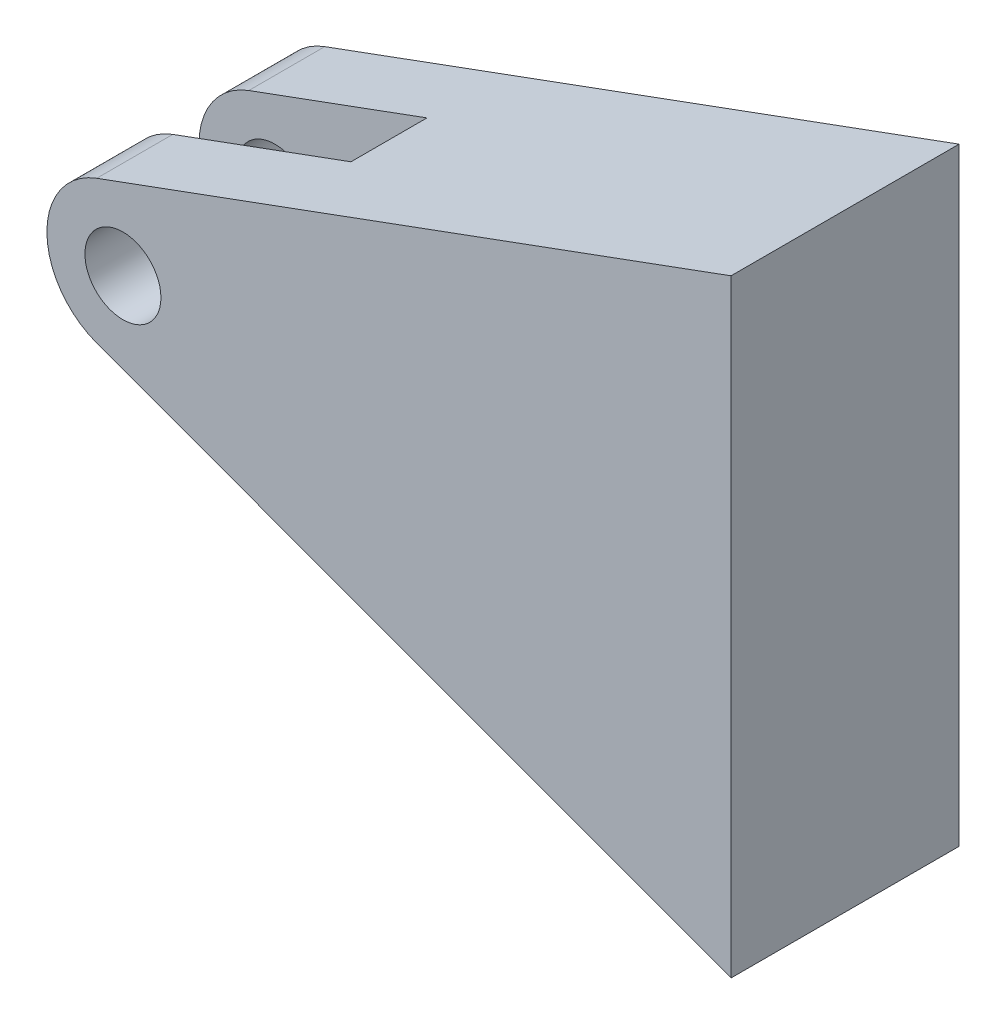
ISO-10303-21;
HEADER;
FILE_DESCRIPTION(('STEP AP214'),'2;1');
FILE_NAME('part.step','',(''),(''),'','','');
FILE_SCHEMA(('AUTOMOTIVE_DESIGN { 1 0 10303 214 1 1 1 1 }'));
ENDSEC;
DATA;
#1=APPLICATION_CONTEXT('core data for automotive mechanical design processes');
#2=APPLICATION_PROTOCOL_DEFINITION('international standard','automotive_design',2000,#1);
#3=PRODUCT_CONTEXT('',#1,'mechanical');
#4=PRODUCT('Part','Part','',(#3));
#5=PRODUCT_RELATED_PRODUCT_CATEGORY('part','',(#4));
#6=PRODUCT_DEFINITION_FORMATION('','',#4);
#7=PRODUCT_DEFINITION_CONTEXT('part definition',#1,'design');
#8=PRODUCT_DEFINITION('design','',#6,#7);
#9=PRODUCT_DEFINITION_SHAPE('','',#8);
#10=(LENGTH_UNIT() NAMED_UNIT(*) SI_UNIT(.MILLI.,.METRE.));
#11=(NAMED_UNIT(*) PLANE_ANGLE_UNIT() SI_UNIT($,.RADIAN.));
#12=(NAMED_UNIT(*) SI_UNIT($,.STERADIAN.) SOLID_ANGLE_UNIT());
#13=UNCERTAINTY_MEASURE_WITH_UNIT(LENGTH_MEASURE(1.E-05),#10,'distance_accuracy_value','');
#14=(GEOMETRIC_REPRESENTATION_CONTEXT(3) GLOBAL_UNCERTAINTY_ASSIGNED_CONTEXT((#13)) GLOBAL_UNIT_ASSIGNED_CONTEXT((#10,
#11,#12)) REPRESENTATION_CONTEXT('',''));
#15=CARTESIAN_POINT('',(0.,0.,0.));
#16=DIRECTION('',(0.,0.,1.));
#17=DIRECTION('',(1.,0.,0.));
#18=AXIS2_PLACEMENT_3D('',#15,#16,#17);
#19=CARTESIAN_POINT('',(0.,0.,15.));
#20=DIRECTION('',(0.,0.,-1.));
#21=DIRECTION('',(-1.,0.,0.));
#22=AXIS2_PLACEMENT_3D('',#19,#20,#21);
#23=CYLINDRICAL_SURFACE('',#22,5.);
#24=CARTESIAN_POINT('',(0.,0.,10.));
#25=DIRECTION('',(0.,0.,1.));
#26=DIRECTION('',(1.,0.,0.));
#27=AXIS2_PLACEMENT_3D('',#24,#25,#26);
#28=CIRCLE('',#27,5.);
#29=CARTESIAN_POINT('',(-1.7220486043289,4.69409720865779,10.));
#30=VERTEX_POINT('',#29);
#31=CARTESIAN_POINT('',(-1.7220486043289,-4.69409720865779,10.));
#32=VERTEX_POINT('',#31);
#33=EDGE_CURVE('E115',#30,#32,#28,.T.);
#34=ORIENTED_EDGE('',*,*,#33,.T.);
#35=DIRECTION('',(0.,0.,-1.));
#36=VECTOR('',#35,1.);
#37=CARTESIAN_POINT('',(-1.7220486043289,-4.69409720865779,15.));
#38=LINE('',#37,#36);
#39=CARTESIAN_POINT('',(-1.7220486043289,-4.69409720865779,15.));
#40=VERTEX_POINT('',#39);
#41=EDGE_CURVE('E157',#40,#32,#38,.T.);
#42=ORIENTED_EDGE('',*,*,#41,.F.);
#43=CARTESIAN_POINT('',(0.,0.,15.));
#44=DIRECTION('',(0.,0.,1.));
#45=DIRECTION('',(1.,0.,0.));
#46=AXIS2_PLACEMENT_3D('',#43,#44,#45);
#47=CIRCLE('',#46,5.);
#48=CARTESIAN_POINT('',(-1.7220486043289,4.69409720865779,15.));
#49=VERTEX_POINT('',#48);
#50=EDGE_CURVE('E143',#49,#40,#47,.T.);
#51=ORIENTED_EDGE('',*,*,#50,.F.);
#52=DIRECTION('',(0.,0.,-1.));
#53=VECTOR('',#52,1.);
#54=CARTESIAN_POINT('',(-1.7220486043289,4.69409720865779,15.));
#55=LINE('',#54,#53);
#56=EDGE_CURVE('E161',#49,#30,#55,.T.);
#57=ORIENTED_EDGE('',*,*,#56,.T.);
#58=EDGE_LOOP('',(#34,#42,#51,#57));
#59=FACE_BOUND('',#58,.T.);
#60=ADVANCED_FACE('F35',(#59),#23,.T.);
#61=CARTESIAN_POINT('',(0.,0.,15.));
#62=DIRECTION('',(0.,0.,-1.));
#63=DIRECTION('',(-1.,0.,0.));
#64=AXIS2_PLACEMENT_3D('',#61,#62,#63);
#65=CYLINDRICAL_SURFACE('',#64,2.5);
#66=CARTESIAN_POINT('',(0.,0.,5.));
#67=DIRECTION('',(0.,0.,-1.));
#68=DIRECTION('',(-1.,0.,0.));
#69=AXIS2_PLACEMENT_3D('',#66,#67,#68);
#70=CIRCLE('',#69,2.5);
#71=CARTESIAN_POINT('',(-2.5,0.,5.));
#72=VERTEX_POINT('',#71);
#73=EDGE_CURVE('E118',#72,#72,#70,.T.);
#74=ORIENTED_EDGE('',*,*,#73,.F.);
#75=EDGE_LOOP('',(#74));
#76=FACE_BOUND('',#75,.T.);
#77=CARTESIAN_POINT('',(0.,0.,0.));
#78=DIRECTION('',(0.,0.,1.));
#79=DIRECTION('',(1.,0.,0.));
#80=AXIS2_PLACEMENT_3D('',#77,#78,#79);
#81=CIRCLE('',#80,2.5);
#82=CARTESIAN_POINT('',(2.5,0.,0.));
#83=VERTEX_POINT('',#82);
#84=EDGE_CURVE('E128',#83,#83,#81,.T.);
#85=ORIENTED_EDGE('',*,*,#84,.F.);
#86=EDGE_LOOP('',(#85));
#87=FACE_BOUND('',#86,.T.);
#88=ADVANCED_FACE('F203',(#76,#87),#65,.F.);
#89=CARTESIAN_POINT('',(0.,0.,15.));
#90=DIRECTION('',(0.,0.,1.));
#91=DIRECTION('',(1.,0.,0.));
#92=AXIS2_PLACEMENT_3D('',#89,#90,#91);
#93=PLANE('',#92);
#94=DIRECTION('',(0.,1.,0.));
#95=VECTOR('',#94,1.);
#96=CARTESIAN_POINT('',(40.,20.,15.));
#97=LINE('',#96,#95);
#98=CARTESIAN_POINT('',(40.,-20.,15.));
#99=VERTEX_POINT('',#98);
#100=CARTESIAN_POINT('',(40.,20.,15.));
#101=VERTEX_POINT('',#100);
#102=EDGE_CURVE('E58',#99,#101,#97,.T.);
#103=ORIENTED_EDGE('',*,*,#102,.T.);
#104=DIRECTION('',(-0.938819441731559,-0.34440972086578,0.));
#105=VECTOR('',#104,1.);
#106=CARTESIAN_POINT('',(40.,20.,15.));
#107=LINE('',#106,#105);
#108=EDGE_CURVE('E87',#101,#49,#107,.T.);
#109=ORIENTED_EDGE('',*,*,#108,.T.);
#110=ORIENTED_EDGE('',*,*,#50,.T.);
#111=DIRECTION('',(0.938819441731559,-0.34440972086578,0.));
#112=VECTOR('',#111,1.);
#113=CARTESIAN_POINT('',(40.,-20.,15.));
#114=LINE('',#113,#112);
#115=EDGE_CURVE('E145',#40,#99,#114,.T.);
#116=ORIENTED_EDGE('',*,*,#115,.T.);
#117=EDGE_LOOP('',(#103,#109,#110,#116));
#118=FACE_BOUND('',#117,.T.);
#119=CARTESIAN_POINT('',(0.,0.,15.));
#120=DIRECTION('',(0.,0.,1.));
#121=DIRECTION('',(1.,0.,0.));
#122=AXIS2_PLACEMENT_3D('',#119,#120,#121);
#123=CIRCLE('',#122,2.5);
#124=CARTESIAN_POINT('',(2.5,0.,15.));
#125=VERTEX_POINT('',#124);
#126=EDGE_CURVE('E131',#125,#125,#123,.T.);
#127=ORIENTED_EDGE('',*,*,#126,.F.);
#128=EDGE_LOOP('',(#127));
#129=FACE_BOUND('',#128,.T.);
#130=ADVANCED_FACE('F185',(#118,#129),#93,.T.);
#131=CARTESIAN_POINT('',(0.,0.,0.));
#132=DIRECTION('',(0.,0.,1.));
#133=DIRECTION('',(1.,0.,0.));
#134=AXIS2_PLACEMENT_3D('',#131,#132,#133);
#135=PLANE('',#134);
#136=DIRECTION('',(-0.938819441731559,-0.34440972086578,0.));
#137=VECTOR('',#136,1.);
#138=CARTESIAN_POINT('',(40.,20.,0.));
#139=LINE('',#138,#137);
#140=CARTESIAN_POINT('',(40.,20.,0.));
#141=VERTEX_POINT('',#140);
#142=CARTESIAN_POINT('',(-1.7220486043289,4.69409720865779,0.));
#143=VERTEX_POINT('',#142);
#144=EDGE_CURVE('E138',#141,#143,#139,.T.);
#145=ORIENTED_EDGE('',*,*,#144,.F.);
#146=DIRECTION('',(0.,1.,0.));
#147=VECTOR('',#146,1.);
#148=CARTESIAN_POINT('',(40.,0.,0.));
#149=LINE('',#148,#147);
#150=CARTESIAN_POINT('',(40.,-20.,0.));
#151=VERTEX_POINT('',#150);
#152=EDGE_CURVE('E141',#151,#141,#149,.T.);
#153=ORIENTED_EDGE('',*,*,#152,.F.);
#154=DIRECTION('',(0.938819441731559,-0.34440972086578,0.));
#155=VECTOR('',#154,1.);
#156=CARTESIAN_POINT('',(40.,-20.,0.));
#157=LINE('',#156,#155);
#158=CARTESIAN_POINT('',(-1.7220486043289,-4.69409720865779,0.));
#159=VERTEX_POINT('',#158);
#160=EDGE_CURVE('E80',#159,#151,#157,.T.);
#161=ORIENTED_EDGE('',*,*,#160,.F.);
#162=CARTESIAN_POINT('',(0.,0.,0.));
#163=DIRECTION('',(0.,0.,1.));
#164=DIRECTION('',(1.,0.,0.));
#165=AXIS2_PLACEMENT_3D('',#162,#163,#164);
#166=CIRCLE('',#165,5.);
#167=EDGE_CURVE('E150',#143,#159,#166,.T.);
#168=ORIENTED_EDGE('',*,*,#167,.F.);
#169=EDGE_LOOP('',(#145,#153,#161,#168));
#170=FACE_BOUND('',#169,.T.);
#171=ORIENTED_EDGE('',*,*,#84,.T.);
#172=EDGE_LOOP('',(#171));
#173=FACE_BOUND('',#172,.T.);
#174=ADVANCED_FACE('F192',(#170,#173),#135,.F.);
#175=CARTESIAN_POINT('',(40.,20.,15.));
#176=DIRECTION('',(0.34440972086578,-0.938819441731559,0.));
#177=DIRECTION('',(0.938819441731559,0.34440972086578,0.));
#178=AXIS2_PLACEMENT_3D('',#175,#176,#177);
#179=PLANE('',#178);
#180=CARTESIAN_POINT('',(-1.7220486043289,4.69409720865779,5.));
#181=VERTEX_POINT('',#180);
#182=EDGE_CURVE('E160',#181,#143,#55,.T.);
#183=ORIENTED_EDGE('',*,*,#182,.F.);
#184=DIRECTION('',(0.938819441731559,0.34440972086578,0.));
#185=VECTOR('',#184,1.);
#186=CARTESIAN_POINT('',(40.,20.,5.));
#187=LINE('',#186,#185);
#188=CARTESIAN_POINT('',(10.,8.99437829395981,5.));
#189=VERTEX_POINT('',#188);
#190=EDGE_CURVE('E127',#181,#189,#187,.T.);
#191=ORIENTED_EDGE('',*,*,#190,.T.);
#192=DIRECTION('',(0.,0.,-1.));
#193=VECTOR('',#192,1.);
#194=CARTESIAN_POINT('',(10.,8.99437829395981,15.));
#195=LINE('',#194,#193);
#196=CARTESIAN_POINT('',(10.,8.99437829395981,10.));
#197=VERTEX_POINT('',#196);
#198=EDGE_CURVE('E121',#197,#189,#195,.T.);
#199=ORIENTED_EDGE('',*,*,#198,.F.);
#200=DIRECTION('',(-0.938819441731559,-0.34440972086578,0.));
#201=VECTOR('',#200,1.);
#202=CARTESIAN_POINT('',(40.,20.,10.));
#203=LINE('',#202,#201);
#204=EDGE_CURVE('E109',#197,#30,#203,.T.);
#205=ORIENTED_EDGE('',*,*,#204,.T.);
#206=ORIENTED_EDGE('',*,*,#56,.F.);
#207=ORIENTED_EDGE('',*,*,#108,.F.);
#208=DIRECTION('',(0.,0.,-1.));
#209=VECTOR('',#208,1.);
#210=CARTESIAN_POINT('',(40.,20.,15.));
#211=LINE('',#210,#209);
#212=EDGE_CURVE('E43',#101,#141,#211,.T.);
#213=ORIENTED_EDGE('',*,*,#212,.T.);
#214=ORIENTED_EDGE('',*,*,#144,.T.);
#215=EDGE_LOOP('',(#183,#191,#199,#205,#206,#207,#213,#214));
#216=FACE_BOUND('',#215,.T.);
#217=ADVANCED_FACE('F37',(#216),#179,.F.);
#218=CARTESIAN_POINT('',(-1.7220486043289,-4.69409720865779,5.));
#219=VERTEX_POINT('',#218);
#220=EDGE_CURVE('E156',#219,#159,#38,.T.);
#221=ORIENTED_EDGE('',*,*,#220,.F.);
#222=CARTESIAN_POINT('',(0.,0.,5.));
#223=DIRECTION('',(0.,0.,-1.));
#224=DIRECTION('',(-1.,0.,0.));
#225=AXIS2_PLACEMENT_3D('',#222,#223,#224);
#226=CIRCLE('',#225,5.);
#227=EDGE_CURVE('E133',#219,#181,#226,.T.);
#228=ORIENTED_EDGE('',*,*,#227,.T.);
#229=ORIENTED_EDGE('',*,*,#182,.T.);
#230=ORIENTED_EDGE('',*,*,#167,.T.);
#231=EDGE_LOOP('',(#221,#228,#229,#230));
#232=FACE_BOUND('',#231,.T.);
#233=ADVANCED_FACE('F195',(#232),#23,.T.);
#234=CARTESIAN_POINT('',(40.,-20.,15.));
#235=DIRECTION('',(0.34440972086578,0.938819441731559,0.));
#236=DIRECTION('',(-0.938819441731559,0.34440972086578,0.));
#237=AXIS2_PLACEMENT_3D('',#234,#235,#236);
#238=PLANE('',#237);
#239=DIRECTION('',(0.,0.,1.));
#240=VECTOR('',#239,1.);
#241=CARTESIAN_POINT('',(10.,-8.9943782939598,15.));
#242=LINE('',#241,#240);
#243=CARTESIAN_POINT('',(10.,-8.9943782939598,5.));
#244=VERTEX_POINT('',#243);
#245=CARTESIAN_POINT('',(10.,-8.9943782939598,10.));
#246=VERTEX_POINT('',#245);
#247=EDGE_CURVE('E11',#244,#246,#242,.T.);
#248=ORIENTED_EDGE('',*,*,#247,.F.);
#249=DIRECTION('',(-0.938819441731559,0.34440972086578,0.));
#250=VECTOR('',#249,1.);
#251=CARTESIAN_POINT('',(40.,-20.,5.));
#252=LINE('',#251,#250);
#253=EDGE_CURVE('E167',#244,#219,#252,.T.);
#254=ORIENTED_EDGE('',*,*,#253,.T.);
#255=ORIENTED_EDGE('',*,*,#220,.T.);
#256=ORIENTED_EDGE('',*,*,#160,.T.);
#257=DIRECTION('',(0.,0.,-1.));
#258=VECTOR('',#257,1.);
#259=CARTESIAN_POINT('',(40.,-20.,15.));
#260=LINE('',#259,#258);
#261=EDGE_CURVE('E147',#99,#151,#260,.T.);
#262=ORIENTED_EDGE('',*,*,#261,.F.);
#263=ORIENTED_EDGE('',*,*,#115,.F.);
#264=ORIENTED_EDGE('',*,*,#41,.T.);
#265=DIRECTION('',(0.938819441731559,-0.34440972086578,0.));
#266=VECTOR('',#265,1.);
#267=CARTESIAN_POINT('',(40.,-20.,10.));
#268=LINE('',#267,#266);
#269=EDGE_CURVE('E165',#32,#246,#268,.T.);
#270=ORIENTED_EDGE('',*,*,#269,.T.);
#271=EDGE_LOOP('',(#248,#254,#255,#256,#262,#263,#264,#270));
#272=FACE_BOUND('',#271,.T.);
#273=ADVANCED_FACE('F179',(#272),#238,.F.);
#274=CARTESIAN_POINT('',(40.,0.,15.));
#275=DIRECTION('',(-1.,0.,0.));
#276=DIRECTION('',(0.,-1.,0.));
#277=AXIS2_PLACEMENT_3D('',#274,#275,#276);
#278=PLANE('',#277);
#279=ORIENTED_EDGE('',*,*,#152,.T.);
#280=ORIENTED_EDGE('',*,*,#212,.F.);
#281=ORIENTED_EDGE('',*,*,#102,.F.);
#282=ORIENTED_EDGE('',*,*,#261,.T.);
#283=EDGE_LOOP('',(#279,#280,#281,#282));
#284=FACE_BOUND('',#283,.T.);
#285=ADVANCED_FACE('F187',(#284),#278,.F.);
#286=CARTESIAN_POINT('',(0.,0.,10.));
#287=DIRECTION('',(0.,0.,1.));
#288=DIRECTION('',(1.,0.,0.));
#289=AXIS2_PLACEMENT_3D('',#286,#287,#288);
#290=CIRCLE('',#289,2.5);
#291=CARTESIAN_POINT('',(2.5,0.,10.));
#292=VERTEX_POINT('',#291);
#293=EDGE_CURVE('E123',#292,#292,#290,.T.);
#294=ORIENTED_EDGE('',*,*,#293,.F.);
#295=EDGE_LOOP('',(#294));
#296=FACE_BOUND('',#295,.T.);
#297=ORIENTED_EDGE('',*,*,#126,.T.);
#298=EDGE_LOOP('',(#297));
#299=FACE_BOUND('',#298,.T.);
#300=ADVANCED_FACE('F209',(#296,#299),#65,.F.);
#301=CARTESIAN_POINT('',(10.,0.,0.));
#302=DIRECTION('',(-1.,0.,0.));
#303=DIRECTION('',(0.,-1.,0.));
#304=AXIS2_PLACEMENT_3D('',#301,#302,#303);
#305=PLANE('',#304);
#306=ORIENTED_EDGE('',*,*,#198,.T.);
#307=DIRECTION('',(0.,1.,0.));
#308=VECTOR('',#307,1.);
#309=CARTESIAN_POINT('',(9.99999999999999,-20.,5.));
#310=LINE('',#309,#308);
#311=EDGE_CURVE('E49',#244,#189,#310,.T.);
#312=ORIENTED_EDGE('',*,*,#311,.F.);
#313=ORIENTED_EDGE('',*,*,#247,.T.);
#314=DIRECTION('',(0.,-1.,0.));
#315=VECTOR('',#314,1.);
#316=CARTESIAN_POINT('',(9.99999999999999,-20.,10.));
#317=LINE('',#316,#315);
#318=EDGE_CURVE('E113',#197,#246,#317,.T.);
#319=ORIENTED_EDGE('',*,*,#318,.F.);
#320=EDGE_LOOP('',(#306,#312,#313,#319));
#321=FACE_BOUND('',#320,.T.);
#322=ADVANCED_FACE('F120',(#321),#305,.T.);
#323=CARTESIAN_POINT('',(-5.00000000000002,-20.,5.));
#324=DIRECTION('',(0.,0.,-1.));
#325=DIRECTION('',(-1.,0.,0.));
#326=AXIS2_PLACEMENT_3D('',#323,#324,#325);
#327=PLANE('',#326);
#328=ORIENTED_EDGE('',*,*,#73,.T.);
#329=EDGE_LOOP('',(#328));
#330=FACE_BOUND('',#329,.T.);
#331=ORIENTED_EDGE('',*,*,#227,.F.);
#332=ORIENTED_EDGE('',*,*,#253,.F.);
#333=ORIENTED_EDGE('',*,*,#311,.T.);
#334=ORIENTED_EDGE('',*,*,#190,.F.);
#335=EDGE_LOOP('',(#331,#332,#333,#334));
#336=FACE_BOUND('',#335,.T.);
#337=ADVANCED_FACE('F178',(#330,#336),#327,.F.);
#338=CARTESIAN_POINT('',(-5.00000000000002,-20.,10.));
#339=DIRECTION('',(0.,0.,1.));
#340=DIRECTION('',(1.,0.,0.));
#341=AXIS2_PLACEMENT_3D('',#338,#339,#340);
#342=PLANE('',#341);
#343=ORIENTED_EDGE('',*,*,#293,.T.);
#344=EDGE_LOOP('',(#343));
#345=FACE_BOUND('',#344,.T.);
#346=ORIENTED_EDGE('',*,*,#318,.T.);
#347=ORIENTED_EDGE('',*,*,#269,.F.);
#348=ORIENTED_EDGE('',*,*,#33,.F.);
#349=ORIENTED_EDGE('',*,*,#204,.F.);
#350=EDGE_LOOP('',(#346,#347,#348,#349));
#351=FACE_BOUND('',#350,.T.);
#352=ADVANCED_FACE('F111',(#345,#351),#342,.F.);
#353=CLOSED_SHELL('',(#60,#88,#130,#174,#217,#233,#273,#285,#300,#322,#337,#352));
#354=MANIFOLD_SOLID_BREP('B2',#353);
#355=ADVANCED_BREP_SHAPE_REPRESENTATION('',(#18,#354),#14);
#356=SHAPE_DEFINITION_REPRESENTATION(#9,#355);
ENDSEC;
END-ISO-10303-21;
